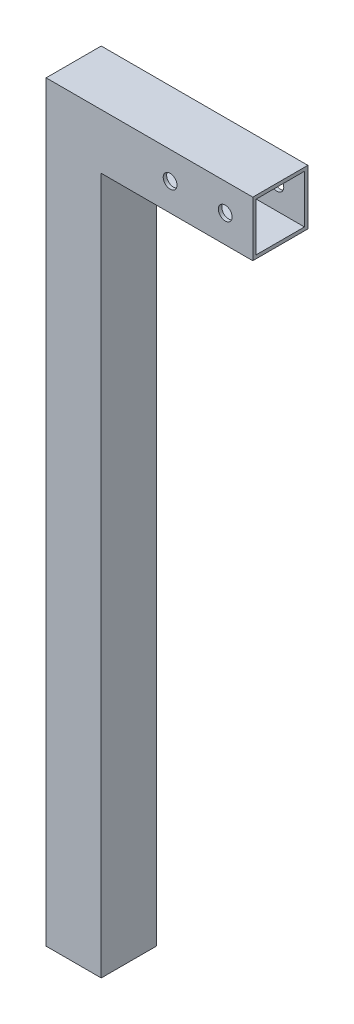
ISO-10303-21;
HEADER;
FILE_DESCRIPTION(('STEP AP214'),'2;1');
FILE_NAME('part.step','',(''),(''),'','','');
FILE_SCHEMA(('AUTOMOTIVE_DESIGN { 1 0 10303 214 1 1 1 1 }'));
ENDSEC;
DATA;
#1=APPLICATION_CONTEXT('core data for automotive mechanical design processes');
#2=APPLICATION_PROTOCOL_DEFINITION('international standard','automotive_design',2000,#1);
#3=PRODUCT_CONTEXT('',#1,'mechanical');
#4=PRODUCT('Part','Part','',(#3));
#5=PRODUCT_RELATED_PRODUCT_CATEGORY('part','',(#4));
#6=PRODUCT_DEFINITION_FORMATION('','',#4);
#7=PRODUCT_DEFINITION_CONTEXT('part definition',#1,'design');
#8=PRODUCT_DEFINITION('design','',#6,#7);
#9=PRODUCT_DEFINITION_SHAPE('','',#8);
#10=(LENGTH_UNIT() NAMED_UNIT(*) SI_UNIT(.MILLI.,.METRE.));
#11=(NAMED_UNIT(*) PLANE_ANGLE_UNIT() SI_UNIT($,.RADIAN.));
#12=(NAMED_UNIT(*) SI_UNIT($,.STERADIAN.) SOLID_ANGLE_UNIT());
#13=UNCERTAINTY_MEASURE_WITH_UNIT(LENGTH_MEASURE(1.E-05),#10,'distance_accuracy_value','');
#14=(GEOMETRIC_REPRESENTATION_CONTEXT(3) GLOBAL_UNCERTAINTY_ASSIGNED_CONTEXT((#13)) GLOBAL_UNIT_ASSIGNED_CONTEXT((#10,
#11,#12)) REPRESENTATION_CONTEXT('',''));
#15=CARTESIAN_POINT('',(0.,0.,0.));
#16=DIRECTION('',(0.,0.,1.));
#17=DIRECTION('',(1.,0.,0.));
#18=AXIS2_PLACEMENT_3D('',#15,#16,#17);
#19=CARTESIAN_POINT('',(0.,0.,0.));
#20=DIRECTION('',(0.,1.,0.));
#21=DIRECTION('',(0.,0.,1.));
#22=AXIS2_PLACEMENT_3D('',#19,#20,#21);
#23=PLANE('',#22);
#24=DIRECTION('',(0.,0.,-1.));
#25=VECTOR('',#24,1.);
#26=CARTESIAN_POINT('',(12.7,0.,-12.7));
#27=LINE('',#26,#25);
#28=CARTESIAN_POINT('',(12.7,0.,12.7));
#29=VERTEX_POINT('',#28);
#30=CARTESIAN_POINT('',(12.7,0.,-12.7));
#31=VERTEX_POINT('',#30);
#32=EDGE_CURVE('E243',#29,#31,#27,.T.);
#33=ORIENTED_EDGE('',*,*,#32,.F.);
#34=DIRECTION('',(1.,0.,0.));
#35=VECTOR('',#34,1.);
#36=CARTESIAN_POINT('',(-12.7,0.,12.7));
#37=LINE('',#36,#35);
#38=CARTESIAN_POINT('',(-12.7,0.,12.7));
#39=VERTEX_POINT('',#38);
#40=EDGE_CURVE('E253',#39,#29,#37,.T.);
#41=ORIENTED_EDGE('',*,*,#40,.F.);
#42=DIRECTION('',(0.,0.,1.));
#43=VECTOR('',#42,1.);
#44=CARTESIAN_POINT('',(-12.7,0.,-12.7));
#45=LINE('',#44,#43);
#46=CARTESIAN_POINT('',(-12.7,0.,-12.7));
#47=VERTEX_POINT('',#46);
#48=EDGE_CURVE('E334',#47,#39,#45,.T.);
#49=ORIENTED_EDGE('',*,*,#48,.F.);
#50=DIRECTION('',(-1.,0.,0.));
#51=VECTOR('',#50,1.);
#52=CARTESIAN_POINT('',(-12.7,0.,-12.7));
#53=LINE('',#52,#51);
#54=EDGE_CURVE('E329',#31,#47,#53,.T.);
#55=ORIENTED_EDGE('',*,*,#54,.F.);
#56=EDGE_LOOP('',(#33,#41,#49,#55));
#57=FACE_BOUND('',#56,.T.);
#58=DIRECTION('',(0.,0.,1.));
#59=VECTOR('',#58,1.);
#60=CARTESIAN_POINT('',(-11.1125,0.,11.1125));
#61=LINE('',#60,#59);
#62=CARTESIAN_POINT('',(-11.1125,0.,-11.1125));
#63=VERTEX_POINT('',#62);
#64=CARTESIAN_POINT('',(-11.1125,0.,11.1125));
#65=VERTEX_POINT('',#64);
#66=EDGE_CURVE('E59',#63,#65,#61,.T.);
#67=ORIENTED_EDGE('',*,*,#66,.T.);
#68=DIRECTION('',(1.,0.,0.));
#69=VECTOR('',#68,1.);
#70=CARTESIAN_POINT('',(11.1125,0.,11.1125));
#71=LINE('',#70,#69);
#72=CARTESIAN_POINT('',(11.1125,0.,11.1125));
#73=VERTEX_POINT('',#72);
#74=EDGE_CURVE('E228',#65,#73,#71,.T.);
#75=ORIENTED_EDGE('',*,*,#74,.T.);
#76=DIRECTION('',(0.,0.,-1.));
#77=VECTOR('',#76,1.);
#78=CARTESIAN_POINT('',(11.1125,0.,11.1125));
#79=LINE('',#78,#77);
#80=CARTESIAN_POINT('',(11.1125,0.,-11.1125));
#81=VERTEX_POINT('',#80);
#82=EDGE_CURVE('E231',#73,#81,#79,.T.);
#83=ORIENTED_EDGE('',*,*,#82,.T.);
#84=DIRECTION('',(-1.,0.,0.));
#85=VECTOR('',#84,1.);
#86=CARTESIAN_POINT('',(11.1125,0.,-11.1125));
#87=LINE('',#86,#85);
#88=EDGE_CURVE('E219',#81,#63,#87,.T.);
#89=ORIENTED_EDGE('',*,*,#88,.T.);
#90=EDGE_LOOP('',(#67,#75,#83,#89));
#91=FACE_BOUND('',#90,.T.);
#92=ADVANCED_FACE('F34',(#57,#91),#23,.F.);
#93=CARTESIAN_POINT('',(12.7,321.23,-12.7));
#94=DIRECTION('',(-1.,0.,0.));
#95=DIRECTION('',(0.,0.,1.));
#96=AXIS2_PLACEMENT_3D('',#93,#94,#95);
#97=PLANE('',#96);
#98=ORIENTED_EDGE('',*,*,#32,.T.);
#99=DIRECTION('',(0.,-1.,0.));
#100=VECTOR('',#99,1.);
#101=CARTESIAN_POINT('',(12.7,321.23,-12.7));
#102=LINE('',#101,#100);
#103=CARTESIAN_POINT('',(12.7,321.23,-12.7));
#104=VERTEX_POINT('',#103);
#105=EDGE_CURVE('E11',#104,#31,#102,.T.);
#106=ORIENTED_EDGE('',*,*,#105,.F.);
#107=DIRECTION('',(0.,0.,-1.));
#108=VECTOR('',#107,1.);
#109=CARTESIAN_POINT('',(12.7,321.23,-12.7));
#110=LINE('',#109,#108);
#111=CARTESIAN_POINT('',(12.7,321.23,12.7));
#112=VERTEX_POINT('',#111);
#113=EDGE_CURVE('E248',#112,#104,#110,.T.);
#114=ORIENTED_EDGE('',*,*,#113,.F.);
#115=DIRECTION('',(0.,-1.,0.));
#116=VECTOR('',#115,1.);
#117=CARTESIAN_POINT('',(12.7,321.23,12.7));
#118=LINE('',#117,#116);
#119=EDGE_CURVE('E252',#112,#29,#118,.T.);
#120=ORIENTED_EDGE('',*,*,#119,.T.);
#121=EDGE_LOOP('',(#98,#106,#114,#120));
#122=FACE_BOUND('',#121,.T.);
#123=ADVANCED_FACE('F36',(#122),#97,.F.);
#124=CARTESIAN_POINT('',(-12.7,321.23,-12.7));
#125=DIRECTION('',(0.,0.,1.));
#126=DIRECTION('',(1.,0.,0.));
#127=AXIS2_PLACEMENT_3D('',#124,#125,#126);
#128=PLANE('',#127);
#129=CARTESIAN_POINT('',(69.85,333.93,-12.7));
#130=DIRECTION('',(0.,0.,1.));
#131=DIRECTION('',(1.,0.,0.));
#132=AXIS2_PLACEMENT_3D('',#129,#130,#131);
#133=CIRCLE('',#132,3.175);
#134=CARTESIAN_POINT('',(73.025,333.93,-12.7));
#135=VERTEX_POINT('',#134);
#136=EDGE_CURVE('E267',#135,#135,#133,.T.);
#137=ORIENTED_EDGE('',*,*,#136,.T.);
#138=EDGE_LOOP('',(#137));
#139=FACE_BOUND('',#138,.T.);
#140=CARTESIAN_POINT('',(44.45,333.93,-12.7));
#141=DIRECTION('',(0.,0.,1.));
#142=DIRECTION('',(1.,0.,0.));
#143=AXIS2_PLACEMENT_3D('',#140,#141,#142);
#144=CIRCLE('',#143,3.175);
#145=CARTESIAN_POINT('',(47.625,333.93,-12.7));
#146=VERTEX_POINT('',#145);
#147=EDGE_CURVE('E170',#146,#146,#144,.T.);
#148=ORIENTED_EDGE('',*,*,#147,.T.);
#149=EDGE_LOOP('',(#148));
#150=FACE_BOUND('',#149,.T.);
#151=ORIENTED_EDGE('',*,*,#54,.T.);
#152=DIRECTION('',(0.,-1.,0.));
#153=VECTOR('',#152,1.);
#154=CARTESIAN_POINT('',(-12.7,321.23,-12.7));
#155=LINE('',#154,#153);
#156=CARTESIAN_POINT('',(-12.7,346.63,-12.7));
#157=VERTEX_POINT('',#156);
#158=EDGE_CURVE('E43',#157,#47,#155,.T.);
#159=ORIENTED_EDGE('',*,*,#158,.F.);
#160=DIRECTION('',(-1.,0.,0.));
#161=VECTOR('',#160,1.);
#162=CARTESIAN_POINT('',(82.55,346.63,-12.7));
#163=LINE('',#162,#161);
#164=CARTESIAN_POINT('',(82.55,346.63,-12.7));
#165=VERTEX_POINT('',#164);
#166=EDGE_CURVE('E201',#165,#157,#163,.T.);
#167=ORIENTED_EDGE('',*,*,#166,.F.);
#168=DIRECTION('',(0.,-1.,0.));
#169=VECTOR('',#168,1.);
#170=CARTESIAN_POINT('',(82.55,321.23,-12.7));
#171=LINE('',#170,#169);
#172=CARTESIAN_POINT('',(82.55,321.23,-12.7));
#173=VERTEX_POINT('',#172);
#174=EDGE_CURVE('E186',#165,#173,#171,.T.);
#175=ORIENTED_EDGE('',*,*,#174,.T.);
#176=DIRECTION('',(-1.,0.,0.));
#177=VECTOR('',#176,1.);
#178=CARTESIAN_POINT('',(82.55,321.23,-12.7));
#179=LINE('',#178,#177);
#180=EDGE_CURVE('E198',#173,#104,#179,.T.);
#181=ORIENTED_EDGE('',*,*,#180,.T.);
#182=ORIENTED_EDGE('',*,*,#105,.T.);
#183=EDGE_LOOP('',(#151,#159,#167,#175,#181,#182));
#184=FACE_BOUND('',#183,.T.);
#185=ADVANCED_FACE('F305',(#139,#150,#184),#128,.F.);
#186=CARTESIAN_POINT('',(-12.7,321.23,-12.7));
#187=DIRECTION('',(1.,0.,0.));
#188=DIRECTION('',(0.,0.,-1.));
#189=AXIS2_PLACEMENT_3D('',#186,#187,#188);
#190=PLANE('',#189);
#191=ORIENTED_EDGE('',*,*,#48,.T.);
#192=DIRECTION('',(0.,-1.,0.));
#193=VECTOR('',#192,1.);
#194=CARTESIAN_POINT('',(-12.7,321.23,12.7));
#195=LINE('',#194,#193);
#196=CARTESIAN_POINT('',(-12.7,346.63,12.7));
#197=VERTEX_POINT('',#196);
#198=EDGE_CURVE('E257',#197,#39,#195,.T.);
#199=ORIENTED_EDGE('',*,*,#198,.F.);
#200=DIRECTION('',(0.,0.,-1.));
#201=VECTOR('',#200,1.);
#202=CARTESIAN_POINT('',(-12.7,346.63,-12.7));
#203=LINE('',#202,#201);
#204=EDGE_CURVE('E182',#197,#157,#203,.T.);
#205=ORIENTED_EDGE('',*,*,#204,.T.);
#206=ORIENTED_EDGE('',*,*,#158,.T.);
#207=EDGE_LOOP('',(#191,#199,#205,#206));
#208=FACE_BOUND('',#207,.T.);
#209=DIRECTION('',(0.,0.,1.));
#210=VECTOR('',#209,1.);
#211=CARTESIAN_POINT('',(-12.7,322.8175,-11.1125));
#212=LINE('',#211,#210);
#213=CARTESIAN_POINT('',(-12.7,322.8175,-11.1125));
#214=VERTEX_POINT('',#213);
#215=CARTESIAN_POINT('',(-12.7,322.8175,11.1125));
#216=VERTEX_POINT('',#215);
#217=EDGE_CURVE('E176',#214,#216,#212,.T.);
#218=ORIENTED_EDGE('',*,*,#217,.F.);
#219=DIRECTION('',(0.,-1.,0.));
#220=VECTOR('',#219,1.);
#221=CARTESIAN_POINT('',(-12.7,322.8175,-11.1125));
#222=LINE('',#221,#220);
#223=CARTESIAN_POINT('',(-12.7,345.0425,-11.1125));
#224=VERTEX_POINT('',#223);
#225=EDGE_CURVE('E146',#224,#214,#222,.T.);
#226=ORIENTED_EDGE('',*,*,#225,.F.);
#227=DIRECTION('',(0.,0.,-1.));
#228=VECTOR('',#227,1.);
#229=CARTESIAN_POINT('',(-12.7,345.0425,-11.1125));
#230=LINE('',#229,#228);
#231=CARTESIAN_POINT('',(-12.7,345.0425,11.1125));
#232=VERTEX_POINT('',#231);
#233=EDGE_CURVE('E164',#232,#224,#230,.T.);
#234=ORIENTED_EDGE('',*,*,#233,.F.);
#235=DIRECTION('',(0.,1.,0.));
#236=VECTOR('',#235,1.);
#237=CARTESIAN_POINT('',(-12.7,322.8175,11.1125));
#238=LINE('',#237,#236);
#239=EDGE_CURVE('E167',#216,#232,#238,.T.);
#240=ORIENTED_EDGE('',*,*,#239,.F.);
#241=EDGE_LOOP('',(#218,#226,#234,#240));
#242=FACE_BOUND('',#241,.T.);
#243=ADVANCED_FACE('F316',(#208,#242),#190,.F.);
#244=CARTESIAN_POINT('',(-12.7,321.23,12.7));
#245=DIRECTION('',(0.,0.,-1.));
#246=DIRECTION('',(-1.,0.,0.));
#247=AXIS2_PLACEMENT_3D('',#244,#245,#246);
#248=PLANE('',#247);
#249=CARTESIAN_POINT('',(69.85,333.93,12.7));
#250=DIRECTION('',(0.,0.,1.));
#251=DIRECTION('',(1.,0.,0.));
#252=AXIS2_PLACEMENT_3D('',#249,#250,#251);
#253=CIRCLE('',#252,3.175);
#254=CARTESIAN_POINT('',(73.025,333.93,12.7));
#255=VERTEX_POINT('',#254);
#256=EDGE_CURVE('E277',#255,#255,#253,.T.);
#257=ORIENTED_EDGE('',*,*,#256,.F.);
#258=EDGE_LOOP('',(#257));
#259=FACE_BOUND('',#258,.T.);
#260=CARTESIAN_POINT('',(44.45,333.93,12.7));
#261=DIRECTION('',(0.,0.,1.));
#262=DIRECTION('',(1.,0.,0.));
#263=AXIS2_PLACEMENT_3D('',#260,#261,#262);
#264=CIRCLE('',#263,3.175);
#265=CARTESIAN_POINT('',(47.625,333.93,12.7));
#266=VERTEX_POINT('',#265);
#267=EDGE_CURVE('E262',#266,#266,#264,.T.);
#268=ORIENTED_EDGE('',*,*,#267,.F.);
#269=EDGE_LOOP('',(#268));
#270=FACE_BOUND('',#269,.T.);
#271=ORIENTED_EDGE('',*,*,#40,.T.);
#272=ORIENTED_EDGE('',*,*,#119,.F.);
#273=DIRECTION('',(-1.,0.,0.));
#274=VECTOR('',#273,1.);
#275=CARTESIAN_POINT('',(82.55,321.23,12.7));
#276=LINE('',#275,#274);
#277=CARTESIAN_POINT('',(82.55,321.23,12.7));
#278=VERTEX_POINT('',#277);
#279=EDGE_CURVE('E207',#278,#112,#276,.T.);
#280=ORIENTED_EDGE('',*,*,#279,.F.);
#281=DIRECTION('',(0.,1.,0.));
#282=VECTOR('',#281,1.);
#283=CARTESIAN_POINT('',(82.55,321.23,12.7));
#284=LINE('',#283,#282);
#285=CARTESIAN_POINT('',(82.55,346.63,12.7));
#286=VERTEX_POINT('',#285);
#287=EDGE_CURVE('E192',#278,#286,#284,.T.);
#288=ORIENTED_EDGE('',*,*,#287,.T.);
#289=DIRECTION('',(-1.,0.,0.));
#290=VECTOR('',#289,1.);
#291=CARTESIAN_POINT('',(82.55,346.63,12.7));
#292=LINE('',#291,#290);
#293=EDGE_CURVE('E204',#286,#197,#292,.T.);
#294=ORIENTED_EDGE('',*,*,#293,.T.);
#295=ORIENTED_EDGE('',*,*,#198,.T.);
#296=EDGE_LOOP('',(#271,#272,#280,#288,#294,#295));
#297=FACE_BOUND('',#296,.T.);
#298=ADVANCED_FACE('F313',(#259,#270,#297),#248,.F.);
#299=CARTESIAN_POINT('',(-11.1125,321.23,11.1125));
#300=DIRECTION('',(1.,0.,0.));
#301=DIRECTION('',(0.,0.,-1.));
#302=AXIS2_PLACEMENT_3D('',#299,#300,#301);
#303=PLANE('',#302);
#304=ORIENTED_EDGE('',*,*,#66,.F.);
#305=DIRECTION('',(0.,-1.,0.));
#306=VECTOR('',#305,1.);
#307=CARTESIAN_POINT('',(-11.1125,321.23,-11.1125));
#308=LINE('',#307,#306);
#309=CARTESIAN_POINT('',(-11.1125,321.23,-11.1125));
#310=VERTEX_POINT('',#309);
#311=EDGE_CURVE('E226',#310,#63,#308,.T.);
#312=ORIENTED_EDGE('',*,*,#311,.F.);
#313=DIRECTION('',(0.,0.,1.));
#314=VECTOR('',#313,1.);
#315=CARTESIAN_POINT('',(-11.1125,321.23,11.1125));
#316=LINE('',#315,#314);
#317=CARTESIAN_POINT('',(-11.1125,321.23,11.1125));
#318=VERTEX_POINT('',#317);
#319=EDGE_CURVE('E215',#310,#318,#316,.T.);
#320=ORIENTED_EDGE('',*,*,#319,.T.);
#321=DIRECTION('',(0.,-1.,0.));
#322=VECTOR('',#321,1.);
#323=CARTESIAN_POINT('',(-11.1125,321.23,11.1125));
#324=LINE('',#323,#322);
#325=EDGE_CURVE('E241',#318,#65,#324,.T.);
#326=ORIENTED_EDGE('',*,*,#325,.T.);
#327=EDGE_LOOP('',(#304,#312,#320,#326));
#328=FACE_BOUND('',#327,.T.);
#329=ADVANCED_FACE('F311',(#328),#303,.T.);
#330=CARTESIAN_POINT('',(11.1125,321.23,11.1125));
#331=DIRECTION('',(0.,0.,-1.));
#332=DIRECTION('',(-1.,0.,0.));
#333=AXIS2_PLACEMENT_3D('',#330,#331,#332);
#334=PLANE('',#333);
#335=ORIENTED_EDGE('',*,*,#74,.F.);
#336=ORIENTED_EDGE('',*,*,#325,.F.);
#337=DIRECTION('',(1.,0.,0.));
#338=VECTOR('',#337,1.);
#339=CARTESIAN_POINT('',(11.1125,321.23,11.1125));
#340=LINE('',#339,#338);
#341=CARTESIAN_POINT('',(11.1125,321.23,11.1125));
#342=VERTEX_POINT('',#341);
#343=EDGE_CURVE('E218',#318,#342,#340,.T.);
#344=ORIENTED_EDGE('',*,*,#343,.T.);
#345=DIRECTION('',(0.,-1.,0.));
#346=VECTOR('',#345,1.);
#347=CARTESIAN_POINT('',(11.1125,321.23,11.1125));
#348=LINE('',#347,#346);
#349=EDGE_CURVE('E239',#342,#73,#348,.T.);
#350=ORIENTED_EDGE('',*,*,#349,.T.);
#351=EDGE_LOOP('',(#335,#336,#344,#350));
#352=FACE_BOUND('',#351,.T.);
#353=ADVANCED_FACE('F373',(#352),#334,.T.);
#354=CARTESIAN_POINT('',(11.1125,321.23,11.1125));
#355=DIRECTION('',(-1.,0.,0.));
#356=DIRECTION('',(0.,0.,1.));
#357=AXIS2_PLACEMENT_3D('',#354,#355,#356);
#358=PLANE('',#357);
#359=ORIENTED_EDGE('',*,*,#82,.F.);
#360=ORIENTED_EDGE('',*,*,#349,.F.);
#361=DIRECTION('',(0.,0.,-1.));
#362=VECTOR('',#361,1.);
#363=CARTESIAN_POINT('',(11.1125,321.23,11.1125));
#364=LINE('',#363,#362);
#365=CARTESIAN_POINT('',(11.1125,321.23,-11.1125));
#366=VERTEX_POINT('',#365);
#367=EDGE_CURVE('E222',#342,#366,#364,.T.);
#368=ORIENTED_EDGE('',*,*,#367,.T.);
#369=DIRECTION('',(0.,-1.,0.));
#370=VECTOR('',#369,1.);
#371=CARTESIAN_POINT('',(11.1125,321.23,-11.1125));
#372=LINE('',#371,#370);
#373=EDGE_CURVE('E237',#366,#81,#372,.T.);
#374=ORIENTED_EDGE('',*,*,#373,.T.);
#375=EDGE_LOOP('',(#359,#360,#368,#374));
#376=FACE_BOUND('',#375,.T.);
#377=ADVANCED_FACE('F368',(#376),#358,.T.);
#378=CARTESIAN_POINT('',(11.1125,321.23,-11.1125));
#379=DIRECTION('',(0.,0.,1.));
#380=DIRECTION('',(1.,0.,0.));
#381=AXIS2_PLACEMENT_3D('',#378,#379,#380);
#382=PLANE('',#381);
#383=ORIENTED_EDGE('',*,*,#88,.F.);
#384=ORIENTED_EDGE('',*,*,#373,.F.);
#385=DIRECTION('',(-1.,0.,0.));
#386=VECTOR('',#385,1.);
#387=CARTESIAN_POINT('',(11.1125,321.23,-11.1125));
#388=LINE('',#387,#386);
#389=EDGE_CURVE('E51',#366,#310,#388,.T.);
#390=ORIENTED_EDGE('',*,*,#389,.T.);
#391=ORIENTED_EDGE('',*,*,#311,.T.);
#392=EDGE_LOOP('',(#383,#384,#390,#391));
#393=FACE_BOUND('',#392,.T.);
#394=ADVANCED_FACE('F364',(#393),#382,.T.);
#395=CARTESIAN_POINT('',(82.55,321.23,-12.7));
#396=DIRECTION('',(0.,-1.,0.));
#397=DIRECTION('',(0.,0.,-1.));
#398=AXIS2_PLACEMENT_3D('',#395,#396,#397);
#399=PLANE('',#398);
#400=ORIENTED_EDGE('',*,*,#343,.F.);
#401=ORIENTED_EDGE('',*,*,#319,.F.);
#402=ORIENTED_EDGE('',*,*,#389,.F.);
#403=ORIENTED_EDGE('',*,*,#367,.F.);
#404=EDGE_LOOP('',(#400,#401,#402,#403));
#405=FACE_BOUND('',#404,.T.);
#406=ADVANCED_FACE('F355',(#405),#399,.T.);
#407=CARTESIAN_POINT('',(82.55,346.63,-12.7));
#408=DIRECTION('',(0.,1.,0.));
#409=DIRECTION('',(0.,0.,1.));
#410=AXIS2_PLACEMENT_3D('',#407,#408,#409);
#411=PLANE('',#410);
#412=ORIENTED_EDGE('',*,*,#204,.F.);
#413=ORIENTED_EDGE('',*,*,#293,.F.);
#414=DIRECTION('',(0.,0.,-1.));
#415=VECTOR('',#414,1.);
#416=CARTESIAN_POINT('',(82.55,346.63,-12.7));
#417=LINE('',#416,#415);
#418=EDGE_CURVE('E195',#286,#165,#417,.T.);
#419=ORIENTED_EDGE('',*,*,#418,.T.);
#420=ORIENTED_EDGE('',*,*,#166,.T.);
#421=EDGE_LOOP('',(#412,#413,#419,#420));
#422=FACE_BOUND('',#421,.T.);
#423=ADVANCED_FACE('F347',(#422),#411,.T.);
#424=ORIENTED_EDGE('',*,*,#279,.T.);
#425=ORIENTED_EDGE('',*,*,#113,.T.);
#426=ORIENTED_EDGE('',*,*,#180,.F.);
#427=DIRECTION('',(0.,0.,1.));
#428=VECTOR('',#427,1.);
#429=CARTESIAN_POINT('',(82.55,321.23,-12.7));
#430=LINE('',#429,#428);
#431=EDGE_CURVE('E189',#173,#278,#430,.T.);
#432=ORIENTED_EDGE('',*,*,#431,.T.);
#433=EDGE_LOOP('',(#424,#425,#426,#432));
#434=FACE_BOUND('',#433,.T.);
#435=ADVANCED_FACE('F351',(#434),#399,.T.);
#436=CARTESIAN_POINT('',(82.55,0.,0.));
#437=DIRECTION('',(1.,0.,0.));
#438=DIRECTION('',(0.,0.,-1.));
#439=AXIS2_PLACEMENT_3D('',#436,#437,#438);
#440=PLANE('',#439);
#441=DIRECTION('',(0.,-1.,0.));
#442=VECTOR('',#441,1.);
#443=CARTESIAN_POINT('',(82.55,322.8175,-11.1125));
#444=LINE('',#443,#442);
#445=CARTESIAN_POINT('',(82.55,345.0425,-11.1125));
#446=VERTEX_POINT('',#445);
#447=CARTESIAN_POINT('',(82.55,322.8175,-11.1125));
#448=VERTEX_POINT('',#447);
#449=EDGE_CURVE('E143',#446,#448,#444,.T.);
#450=ORIENTED_EDGE('',*,*,#449,.T.);
#451=DIRECTION('',(0.,0.,1.));
#452=VECTOR('',#451,1.);
#453=CARTESIAN_POINT('',(82.55,322.8175,-11.1125));
#454=LINE('',#453,#452);
#455=CARTESIAN_POINT('',(82.55,322.8175,11.1125));
#456=VERTEX_POINT('',#455);
#457=EDGE_CURVE('E155',#448,#456,#454,.T.);
#458=ORIENTED_EDGE('',*,*,#457,.T.);
#459=DIRECTION('',(0.,1.,0.));
#460=VECTOR('',#459,1.);
#461=CARTESIAN_POINT('',(82.55,322.8175,11.1125));
#462=LINE('',#461,#460);
#463=CARTESIAN_POINT('',(82.55,345.0425,11.1125));
#464=VERTEX_POINT('',#463);
#465=EDGE_CURVE('E159',#456,#464,#462,.T.);
#466=ORIENTED_EDGE('',*,*,#465,.T.);
#467=DIRECTION('',(0.,0.,-1.));
#468=VECTOR('',#467,1.);
#469=CARTESIAN_POINT('',(82.55,345.0425,-11.1125));
#470=LINE('',#469,#468);
#471=EDGE_CURVE('E151',#464,#446,#470,.T.);
#472=ORIENTED_EDGE('',*,*,#471,.T.);
#473=EDGE_LOOP('',(#450,#458,#466,#472));
#474=FACE_BOUND('',#473,.T.);
#475=ORIENTED_EDGE('',*,*,#174,.F.);
#476=ORIENTED_EDGE('',*,*,#418,.F.);
#477=ORIENTED_EDGE('',*,*,#287,.F.);
#478=ORIENTED_EDGE('',*,*,#431,.F.);
#479=EDGE_LOOP('',(#475,#476,#477,#478));
#480=FACE_BOUND('',#479,.T.);
#481=ADVANCED_FACE('F161',(#474,#480),#440,.T.);
#482=CARTESIAN_POINT('',(82.55,322.8175,-11.1125));
#483=DIRECTION('',(0.,0.,-1.));
#484=DIRECTION('',(-1.,0.,0.));
#485=AXIS2_PLACEMENT_3D('',#482,#483,#484);
#486=PLANE('',#485);
#487=CARTESIAN_POINT('',(69.85,333.93,-11.1125));
#488=DIRECTION('',(0.,0.,-1.));
#489=DIRECTION('',(-1.,0.,0.));
#490=AXIS2_PLACEMENT_3D('',#487,#488,#489);
#491=CIRCLE('',#490,3.175);
#492=CARTESIAN_POINT('',(66.675,333.93,-11.1125));
#493=VERTEX_POINT('',#492);
#494=EDGE_CURVE('E272',#493,#493,#491,.T.);
#495=ORIENTED_EDGE('',*,*,#494,.T.);
#496=EDGE_LOOP('',(#495));
#497=FACE_BOUND('',#496,.T.);
#498=CARTESIAN_POINT('',(44.45,333.93,-11.1125));
#499=DIRECTION('',(0.,0.,-1.));
#500=DIRECTION('',(-1.,0.,0.));
#501=AXIS2_PLACEMENT_3D('',#498,#499,#500);
#502=CIRCLE('',#501,3.175);
#503=CARTESIAN_POINT('',(41.275,333.93,-11.1125));
#504=VERTEX_POINT('',#503);
#505=EDGE_CURVE('E261',#504,#504,#502,.T.);
#506=ORIENTED_EDGE('',*,*,#505,.T.);
#507=EDGE_LOOP('',(#506));
#508=FACE_BOUND('',#507,.T.);
#509=ORIENTED_EDGE('',*,*,#225,.T.);
#510=DIRECTION('',(-1.,0.,0.));
#511=VECTOR('',#510,1.);
#512=CARTESIAN_POINT('',(82.55,322.8175,-11.1125));
#513=LINE('',#512,#511);
#514=EDGE_CURVE('E139',#448,#214,#513,.T.);
#515=ORIENTED_EDGE('',*,*,#514,.F.);
#516=ORIENTED_EDGE('',*,*,#449,.F.);
#517=DIRECTION('',(-1.,0.,0.));
#518=VECTOR('',#517,1.);
#519=CARTESIAN_POINT('',(82.55,345.0425,-11.1125));
#520=LINE('',#519,#518);
#521=EDGE_CURVE('E180',#446,#224,#520,.T.);
#522=ORIENTED_EDGE('',*,*,#521,.T.);
#523=EDGE_LOOP('',(#509,#515,#516,#522));
#524=FACE_BOUND('',#523,.T.);
#525=ADVANCED_FACE('F141',(#497,#508,#524),#486,.F.);
#526=CARTESIAN_POINT('',(82.55,345.0425,-11.1125));
#527=DIRECTION('',(0.,1.,0.));
#528=DIRECTION('',(0.,0.,1.));
#529=AXIS2_PLACEMENT_3D('',#526,#527,#528);
#530=PLANE('',#529);
#531=ORIENTED_EDGE('',*,*,#233,.T.);
#532=ORIENTED_EDGE('',*,*,#521,.F.);
#533=ORIENTED_EDGE('',*,*,#471,.F.);
#534=DIRECTION('',(-1.,0.,0.));
#535=VECTOR('',#534,1.);
#536=CARTESIAN_POINT('',(82.55,345.0425,11.1125));
#537=LINE('',#536,#535);
#538=EDGE_CURVE('E183',#464,#232,#537,.T.);
#539=ORIENTED_EDGE('',*,*,#538,.T.);
#540=EDGE_LOOP('',(#531,#532,#533,#539));
#541=FACE_BOUND('',#540,.T.);
#542=ADVANCED_FACE('F480',(#541),#530,.F.);
#543=CARTESIAN_POINT('',(82.55,322.8175,11.1125));
#544=DIRECTION('',(0.,0.,1.));
#545=DIRECTION('',(1.,0.,0.));
#546=AXIS2_PLACEMENT_3D('',#543,#544,#545);
#547=PLANE('',#546);
#548=CARTESIAN_POINT('',(69.85,333.93,11.1125));
#549=DIRECTION('',(0.,0.,1.));
#550=DIRECTION('',(1.,0.,0.));
#551=AXIS2_PLACEMENT_3D('',#548,#549,#550);
#552=CIRCLE('',#551,3.175);
#553=CARTESIAN_POINT('',(73.025,333.93,11.1125));
#554=VERTEX_POINT('',#553);
#555=EDGE_CURVE('E38',#554,#554,#552,.T.);
#556=ORIENTED_EDGE('',*,*,#555,.T.);
#557=EDGE_LOOP('',(#556));
#558=FACE_BOUND('',#557,.T.);
#559=CARTESIAN_POINT('',(44.45,333.93,11.1125));
#560=DIRECTION('',(0.,0.,1.));
#561=DIRECTION('',(1.,0.,0.));
#562=AXIS2_PLACEMENT_3D('',#559,#560,#561);
#563=CIRCLE('',#562,3.175);
#564=CARTESIAN_POINT('',(47.625,333.93,11.1125));
#565=VERTEX_POINT('',#564);
#566=EDGE_CURVE('E259',#565,#565,#563,.T.);
#567=ORIENTED_EDGE('',*,*,#566,.T.);
#568=EDGE_LOOP('',(#567));
#569=FACE_BOUND('',#568,.T.);
#570=ORIENTED_EDGE('',*,*,#239,.T.);
#571=ORIENTED_EDGE('',*,*,#538,.F.);
#572=ORIENTED_EDGE('',*,*,#465,.F.);
#573=DIRECTION('',(-1.,0.,0.));
#574=VECTOR('',#573,1.);
#575=CARTESIAN_POINT('',(82.55,322.8175,11.1125));
#576=LINE('',#575,#574);
#577=EDGE_CURVE('E150',#456,#216,#576,.T.);
#578=ORIENTED_EDGE('',*,*,#577,.T.);
#579=EDGE_LOOP('',(#570,#571,#572,#578));
#580=FACE_BOUND('',#579,.T.);
#581=ADVANCED_FACE('F284',(#558,#569,#580),#547,.F.);
#582=CARTESIAN_POINT('',(82.55,322.8175,-11.1125));
#583=DIRECTION('',(0.,-1.,0.));
#584=DIRECTION('',(0.,0.,-1.));
#585=AXIS2_PLACEMENT_3D('',#582,#583,#584);
#586=PLANE('',#585);
#587=ORIENTED_EDGE('',*,*,#217,.T.);
#588=ORIENTED_EDGE('',*,*,#577,.F.);
#589=ORIENTED_EDGE('',*,*,#457,.F.);
#590=ORIENTED_EDGE('',*,*,#514,.T.);
#591=EDGE_LOOP('',(#587,#588,#589,#590));
#592=FACE_BOUND('',#591,.T.);
#593=ADVANCED_FACE('F156',(#592),#586,.F.);
#594=CARTESIAN_POINT('',(44.45,333.93,-12.70005));
#595=DIRECTION('',(0.,0.,1.));
#596=DIRECTION('',(1.,0.,0.));
#597=AXIS2_PLACEMENT_3D('',#594,#595,#596);
#598=CYLINDRICAL_SURFACE('',#597,3.175);
#599=ORIENTED_EDGE('',*,*,#267,.T.);
#600=EDGE_LOOP('',(#599));
#601=FACE_BOUND('',#600,.T.);
#602=ORIENTED_EDGE('',*,*,#566,.F.);
#603=EDGE_LOOP('',(#602));
#604=FACE_BOUND('',#603,.T.);
#605=ADVANCED_FACE('F296',(#601,#604),#598,.F.);
#606=ORIENTED_EDGE('',*,*,#505,.F.);
#607=EDGE_LOOP('',(#606));
#608=FACE_BOUND('',#607,.T.);
#609=ORIENTED_EDGE('',*,*,#147,.F.);
#610=EDGE_LOOP('',(#609));
#611=FACE_BOUND('',#610,.T.);
#612=ADVANCED_FACE('F289',(#608,#611),#598,.F.);
#613=CARTESIAN_POINT('',(69.85,333.93,-12.70005));
#614=DIRECTION('',(0.,0.,1.));
#615=DIRECTION('',(1.,0.,0.));
#616=AXIS2_PLACEMENT_3D('',#613,#614,#615);
#617=CYLINDRICAL_SURFACE('',#616,3.175);
#618=ORIENTED_EDGE('',*,*,#256,.T.);
#619=EDGE_LOOP('',(#618));
#620=FACE_BOUND('',#619,.T.);
#621=ORIENTED_EDGE('',*,*,#555,.F.);
#622=EDGE_LOOP('',(#621));
#623=FACE_BOUND('',#622,.T.);
#624=ADVANCED_FACE('F286',(#620,#623),#617,.F.);
#625=ORIENTED_EDGE('',*,*,#494,.F.);
#626=EDGE_LOOP('',(#625));
#627=FACE_BOUND('',#626,.T.);
#628=ORIENTED_EDGE('',*,*,#136,.F.);
#629=EDGE_LOOP('',(#628));
#630=FACE_BOUND('',#629,.T.);
#631=ADVANCED_FACE('F288',(#627,#630),#617,.F.);
#632=CLOSED_SHELL('',(#92,#123,#185,#243,#298,#329,#353,#377,#394,#406,#423,#435,#481,#525,#542,
#581,#593,#605,#612,#624,#631));
#633=MANIFOLD_SOLID_BREP('B2',#632);
#634=ADVANCED_BREP_SHAPE_REPRESENTATION('',(#18,#633),#14);
#635=SHAPE_DEFINITION_REPRESENTATION(#9,#634);
ENDSEC;
END-ISO-10303-21;
